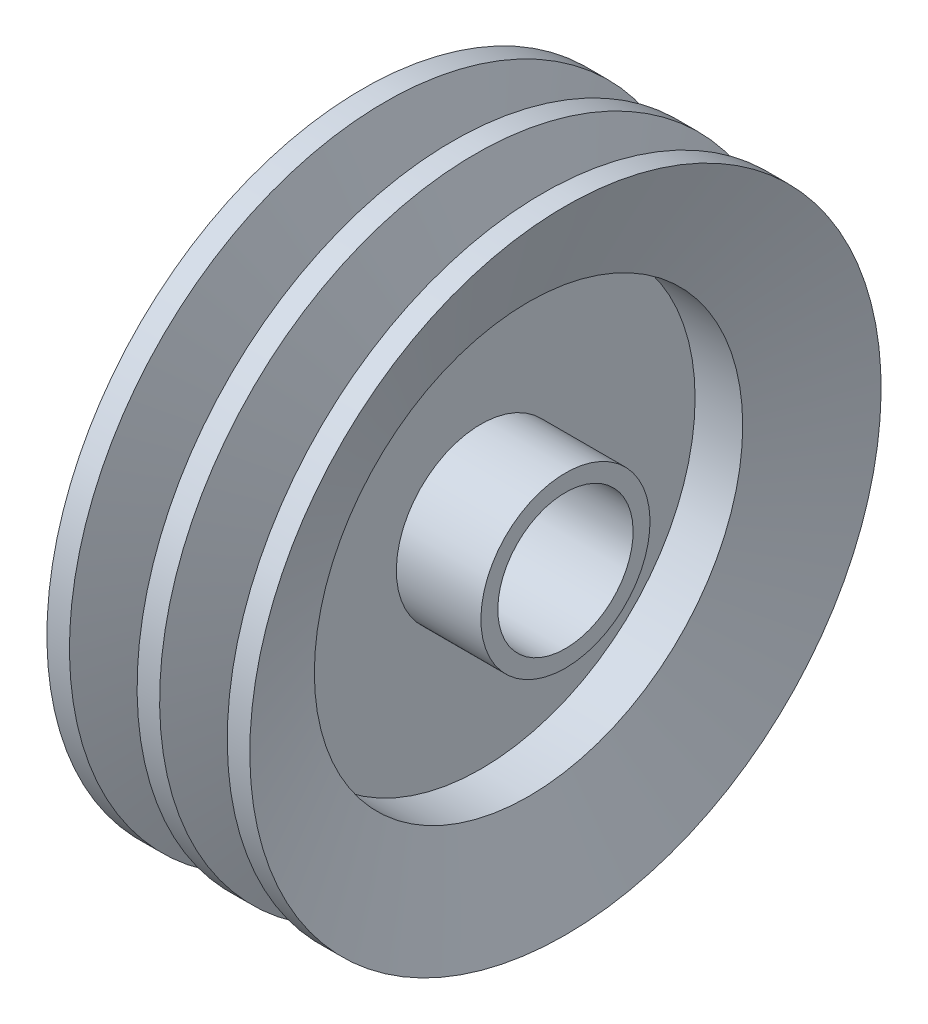
ISO-10303-21;
HEADER;
FILE_DESCRIPTION(('STEP AP214'),'2;1');
FILE_NAME('part.step','',(''),(''),'','','');
FILE_SCHEMA(('AUTOMOTIVE_DESIGN { 1 0 10303 214 1 1 1 1 }'));
ENDSEC;
DATA;
#1=APPLICATION_CONTEXT('core data for automotive mechanical design processes');
#2=APPLICATION_PROTOCOL_DEFINITION('international standard','automotive_design',2000,#1);
#3=PRODUCT_CONTEXT('',#1,'mechanical');
#4=PRODUCT('Part','Part','',(#3));
#5=PRODUCT_RELATED_PRODUCT_CATEGORY('part','',(#4));
#6=PRODUCT_DEFINITION_FORMATION('','',#4);
#7=PRODUCT_DEFINITION_CONTEXT('part definition',#1,'design');
#8=PRODUCT_DEFINITION('design','',#6,#7);
#9=PRODUCT_DEFINITION_SHAPE('','',#8);
#10=(LENGTH_UNIT() NAMED_UNIT(*) SI_UNIT(.MILLI.,.METRE.));
#11=(NAMED_UNIT(*) PLANE_ANGLE_UNIT() SI_UNIT($,.RADIAN.));
#12=(NAMED_UNIT(*) SI_UNIT($,.STERADIAN.) SOLID_ANGLE_UNIT());
#13=UNCERTAINTY_MEASURE_WITH_UNIT(LENGTH_MEASURE(1.E-05),#10,'distance_accuracy_value','');
#14=(GEOMETRIC_REPRESENTATION_CONTEXT(3) GLOBAL_UNCERTAINTY_ASSIGNED_CONTEXT((#13)) GLOBAL_UNIT_ASSIGNED_CONTEXT((#10,
#11,#12)) REPRESENTATION_CONTEXT('',''));
#15=CARTESIAN_POINT('',(0.,0.,0.));
#16=DIRECTION('',(0.,0.,1.));
#17=DIRECTION('',(1.,0.,0.));
#18=AXIS2_PLACEMENT_3D('',#15,#16,#17);
#19=CARTESIAN_POINT('',(45.,37.5,0.));
#20=DIRECTION('',(-1.,0.,0.));
#21=DIRECTION('',(0.,-1.,0.));
#22=AXIS2_PLACEMENT_3D('',#19,#20,#21);
#23=PLANE('',#22);
#24=CARTESIAN_POINT('',(45.,0.,0.));
#25=DIRECTION('',(-1.,0.,0.));
#26=DIRECTION('',(0.,-1.,0.));
#27=AXIS2_PLACEMENT_3D('',#24,#25,#26);
#28=CIRCLE('',#27,37.5);
#29=CARTESIAN_POINT('',(45.,-37.5,0.));
#30=VERTEX_POINT('',#29);
#31=EDGE_CURVE('E10',#30,#30,#28,.T.);
#32=ORIENTED_EDGE('',*,*,#31,.F.);
#33=EDGE_LOOP('',(#32));
#34=FACE_BOUND('',#33,.T.);
#35=CARTESIAN_POINT('',(45.,0.,0.));
#36=DIRECTION('',(-1.,0.,0.));
#37=DIRECTION('',(0.,-1.,0.));
#38=AXIS2_PLACEMENT_3D('',#35,#36,#37);
#39=CIRCLE('',#38,30.);
#40=CARTESIAN_POINT('',(45.,-30.,0.));
#41=VERTEX_POINT('',#40);
#42=EDGE_CURVE('E99',#41,#41,#39,.T.);
#43=ORIENTED_EDGE('',*,*,#42,.T.);
#44=EDGE_LOOP('',(#43));
#45=FACE_BOUND('',#44,.T.);
#46=ADVANCED_FACE('F35',(#34,#45),#23,.F.);
#47=CARTESIAN_POINT('',(-45.,0.,0.));
#48=DIRECTION('',(-1.,0.,0.));
#49=DIRECTION('',(0.,-1.,0.));
#50=AXIS2_PLACEMENT_3D('',#47,#48,#49);
#51=CYLINDRICAL_SURFACE('',#50,37.5);
#52=CARTESIAN_POINT('',(7.50000000000001,0.,0.));
#53=DIRECTION('',(-1.,0.,0.));
#54=DIRECTION('',(0.,-1.,0.));
#55=AXIS2_PLACEMENT_3D('',#52,#53,#54);
#56=CIRCLE('',#55,37.5);
#57=CARTESIAN_POINT('',(7.50000000000001,-37.5,0.));
#58=VERTEX_POINT('',#57);
#59=EDGE_CURVE('E41',#58,#58,#56,.T.);
#60=ORIENTED_EDGE('',*,*,#59,.F.);
#61=EDGE_LOOP('',(#60));
#62=FACE_BOUND('',#61,.T.);
#63=ORIENTED_EDGE('',*,*,#31,.T.);
#64=EDGE_LOOP('',(#63));
#65=FACE_BOUND('',#64,.T.);
#66=ADVANCED_FACE('F208',(#62,#65),#51,.T.);
#67=CARTESIAN_POINT('',(7.49999999999999,95.,0.));
#68=DIRECTION('',(-1.,0.,0.));
#69=DIRECTION('',(0.,-1.,0.));
#70=AXIS2_PLACEMENT_3D('',#67,#68,#69);
#71=PLANE('',#70);
#72=CARTESIAN_POINT('',(7.50000000000001,0.,0.));
#73=DIRECTION('',(-1.,0.,0.));
#74=DIRECTION('',(0.,-1.,0.));
#75=AXIS2_PLACEMENT_3D('',#72,#73,#74);
#76=CIRCLE('',#75,95.);
#77=CARTESIAN_POINT('',(7.50000000000003,-95.,0.));
#78=VERTEX_POINT('',#77);
#79=EDGE_CURVE('E45',#78,#78,#76,.T.);
#80=ORIENTED_EDGE('',*,*,#79,.F.);
#81=EDGE_LOOP('',(#80));
#82=FACE_BOUND('',#81,.T.);
#83=ORIENTED_EDGE('',*,*,#59,.T.);
#84=EDGE_LOOP('',(#83));
#85=FACE_BOUND('',#84,.T.);
#86=ADVANCED_FACE('F203',(#82,#85),#71,.F.);
#87=CARTESIAN_POINT('',(-45.,0.,0.));
#88=DIRECTION('',(-1.,0.,0.));
#89=DIRECTION('',(0.,-1.,0.));
#90=AXIS2_PLACEMENT_3D('',#87,#88,#89);
#91=CYLINDRICAL_SURFACE('',#90,95.);
#92=CARTESIAN_POINT('',(28.6213394580211,0.,0.));
#93=DIRECTION('',(-1.,0.,0.));
#94=DIRECTION('',(0.,-1.,0.));
#95=AXIS2_PLACEMENT_3D('',#92,#93,#94);
#96=CIRCLE('',#95,95.);
#97=CARTESIAN_POINT('',(28.6213394580211,-95.,0.));
#98=VERTEX_POINT('',#97);
#99=EDGE_CURVE('E49',#98,#98,#96,.T.);
#100=ORIENTED_EDGE('',*,*,#99,.F.);
#101=EDGE_LOOP('',(#100));
#102=FACE_BOUND('',#101,.T.);
#103=ORIENTED_EDGE('',*,*,#79,.T.);
#104=EDGE_LOOP('',(#103));
#105=FACE_BOUND('',#104,.T.);
#106=ADVANCED_FACE('F197',(#102,#105),#91,.F.);
#107=CARTESIAN_POINT('',(28.6213394580211,0.,0.));
#108=DIRECTION('',(1.,0.,0.));
#109=DIRECTION('',(0.,1.,0.));
#110=AXIS2_PLACEMENT_3D('',#107,#108,#109);
#111=CONICAL_SURFACE('',#110,95.,1.22173047639603);
#112=CARTESIAN_POINT('',(45.,0.,0.));
#113=DIRECTION('',(-1.,0.,0.));
#114=DIRECTION('',(0.,-1.,0.));
#115=AXIS2_PLACEMENT_3D('',#112,#113,#114);
#116=CIRCLE('',#115,140.);
#117=CARTESIAN_POINT('',(45.0000000000001,-140.,0.));
#118=VERTEX_POINT('',#117);
#119=EDGE_CURVE('E54',#118,#118,#116,.T.);
#120=ORIENTED_EDGE('',*,*,#119,.F.);
#121=EDGE_LOOP('',(#120));
#122=FACE_BOUND('',#121,.T.);
#123=ORIENTED_EDGE('',*,*,#99,.T.);
#124=EDGE_LOOP('',(#123));
#125=FACE_BOUND('',#124,.T.);
#126=ADVANCED_FACE('F191',(#122,#125),#111,.F.);
#127=CARTESIAN_POINT('',(-45.,0.,0.));
#128=DIRECTION('',(-1.,0.,0.));
#129=DIRECTION('',(0.,-1.,0.));
#130=AXIS2_PLACEMENT_3D('',#127,#128,#129);
#131=CYLINDRICAL_SURFACE('',#130,140.);
#132=CARTESIAN_POINT('',(35.,0.,0.));
#133=DIRECTION('',(-1.,0.,0.));
#134=DIRECTION('',(0.,-1.,0.));
#135=AXIS2_PLACEMENT_3D('',#132,#133,#134);
#136=CIRCLE('',#135,140.);
#137=CARTESIAN_POINT('',(35.,-140.,0.));
#138=VERTEX_POINT('',#137);
#139=EDGE_CURVE('E57',#138,#138,#136,.T.);
#140=ORIENTED_EDGE('',*,*,#139,.F.);
#141=EDGE_LOOP('',(#140));
#142=FACE_BOUND('',#141,.T.);
#143=ORIENTED_EDGE('',*,*,#119,.T.);
#144=EDGE_LOOP('',(#143));
#145=FACE_BOUND('',#144,.T.);
#146=ADVANCED_FACE('F185',(#142,#145),#131,.T.);
#147=CARTESIAN_POINT('',(35.,0.,0.));
#148=DIRECTION('',(1.,0.,0.));
#149=DIRECTION('',(0.,1.,0.));
#150=AXIS2_PLACEMENT_3D('',#147,#148,#149);
#151=CONICAL_SURFACE('',#150,140.,1.22173047639603);
#152=CARTESIAN_POINT('',(24.080892972014,0.,0.));
#153=DIRECTION('',(-1.,0.,0.));
#154=DIRECTION('',(0.,-1.,0.));
#155=AXIS2_PLACEMENT_3D('',#152,#153,#154);
#156=CIRCLE('',#155,110.);
#157=CARTESIAN_POINT('',(24.0808929720141,-110.,0.));
#158=VERTEX_POINT('',#157);
#159=EDGE_CURVE('E60',#158,#158,#156,.T.);
#160=ORIENTED_EDGE('',*,*,#159,.F.);
#161=EDGE_LOOP('',(#160));
#162=FACE_BOUND('',#161,.T.);
#163=ORIENTED_EDGE('',*,*,#139,.T.);
#164=EDGE_LOOP('',(#163));
#165=FACE_BOUND('',#164,.T.);
#166=ADVANCED_FACE('F179',(#162,#165),#151,.T.);
#167=CARTESIAN_POINT('',(-45.,0.,0.));
#168=DIRECTION('',(-1.,0.,0.));
#169=DIRECTION('',(0.,-1.,0.));
#170=AXIS2_PLACEMENT_3D('',#167,#168,#169);
#171=CYLINDRICAL_SURFACE('',#170,110.);
#172=CARTESIAN_POINT('',(15.919107027986,0.,0.));
#173=DIRECTION('',(-1.,0.,0.));
#174=DIRECTION('',(0.,-1.,0.));
#175=AXIS2_PLACEMENT_3D('',#172,#173,#174);
#176=CIRCLE('',#175,110.);
#177=CARTESIAN_POINT('',(15.919107027986,-110.,0.));
#178=VERTEX_POINT('',#177);
#179=EDGE_CURVE('E63',#178,#178,#176,.T.);
#180=ORIENTED_EDGE('',*,*,#179,.F.);
#181=EDGE_LOOP('',(#180));
#182=FACE_BOUND('',#181,.T.);
#183=ORIENTED_EDGE('',*,*,#159,.T.);
#184=EDGE_LOOP('',(#183));
#185=FACE_BOUND('',#184,.T.);
#186=ADVANCED_FACE('F173',(#182,#185),#171,.T.);
#187=CARTESIAN_POINT('',(15.919107027986,0.,0.));
#188=DIRECTION('',(-1.,0.,0.));
#189=DIRECTION('',(0.,-1.,0.));
#190=AXIS2_PLACEMENT_3D('',#187,#188,#189);
#191=CONICAL_SURFACE('',#190,110.,1.22173047639603);
#192=CARTESIAN_POINT('',(5.00000000000002,0.,0.));
#193=DIRECTION('',(-1.,0.,0.));
#194=DIRECTION('',(0.,-1.,0.));
#195=AXIS2_PLACEMENT_3D('',#192,#193,#194);
#196=CIRCLE('',#195,140.);
#197=CARTESIAN_POINT('',(5.00000000000005,-140.,0.));
#198=VERTEX_POINT('',#197);
#199=EDGE_CURVE('E66',#198,#198,#196,.T.);
#200=ORIENTED_EDGE('',*,*,#199,.F.);
#201=EDGE_LOOP('',(#200));
#202=FACE_BOUND('',#201,.T.);
#203=ORIENTED_EDGE('',*,*,#179,.T.);
#204=EDGE_LOOP('',(#203));
#205=FACE_BOUND('',#204,.T.);
#206=ADVANCED_FACE('F167',(#202,#205),#191,.T.);
#207=CARTESIAN_POINT('',(-45.,0.,0.));
#208=DIRECTION('',(-1.,0.,0.));
#209=DIRECTION('',(0.,-1.,0.));
#210=AXIS2_PLACEMENT_3D('',#207,#208,#209);
#211=CYLINDRICAL_SURFACE('',#210,140.);
#212=CARTESIAN_POINT('',(-4.99999999999997,0.,0.));
#213=DIRECTION('',(-1.,0.,0.));
#214=DIRECTION('',(0.,-1.,0.));
#215=AXIS2_PLACEMENT_3D('',#212,#213,#214);
#216=CIRCLE('',#215,140.);
#217=CARTESIAN_POINT('',(-4.99999999999994,-140.,0.));
#218=VERTEX_POINT('',#217);
#219=EDGE_CURVE('E69',#218,#218,#216,.T.);
#220=ORIENTED_EDGE('',*,*,#219,.F.);
#221=EDGE_LOOP('',(#220));
#222=FACE_BOUND('',#221,.T.);
#223=ORIENTED_EDGE('',*,*,#199,.T.);
#224=EDGE_LOOP('',(#223));
#225=FACE_BOUND('',#224,.T.);
#226=ADVANCED_FACE('F161',(#222,#225),#211,.T.);
#227=CARTESIAN_POINT('',(-4.99999999999997,0.,0.));
#228=DIRECTION('',(1.,0.,0.));
#229=DIRECTION('',(0.,1.,0.));
#230=AXIS2_PLACEMENT_3D('',#227,#228,#229);
#231=CONICAL_SURFACE('',#230,140.,1.22173047639603);
#232=CARTESIAN_POINT('',(-15.919107027986,0.,0.));
#233=DIRECTION('',(-1.,0.,0.));
#234=DIRECTION('',(0.,-1.,0.));
#235=AXIS2_PLACEMENT_3D('',#232,#233,#234);
#236=CIRCLE('',#235,110.);
#237=CARTESIAN_POINT('',(-15.9191070279859,-110.,0.));
#238=VERTEX_POINT('',#237);
#239=EDGE_CURVE('E72',#238,#238,#236,.T.);
#240=ORIENTED_EDGE('',*,*,#239,.F.);
#241=EDGE_LOOP('',(#240));
#242=FACE_BOUND('',#241,.T.);
#243=ORIENTED_EDGE('',*,*,#219,.T.);
#244=EDGE_LOOP('',(#243));
#245=FACE_BOUND('',#244,.T.);
#246=ADVANCED_FACE('F155',(#242,#245),#231,.T.);
#247=CARTESIAN_POINT('',(-45.,0.,0.));
#248=DIRECTION('',(-1.,0.,0.));
#249=DIRECTION('',(0.,-1.,0.));
#250=AXIS2_PLACEMENT_3D('',#247,#248,#249);
#251=CYLINDRICAL_SURFACE('',#250,110.);
#252=CARTESIAN_POINT('',(-24.080892972014,0.,0.));
#253=DIRECTION('',(-1.,0.,0.));
#254=DIRECTION('',(0.,-1.,0.));
#255=AXIS2_PLACEMENT_3D('',#252,#253,#254);
#256=CIRCLE('',#255,110.);
#257=CARTESIAN_POINT('',(-24.080892972014,-110.,0.));
#258=VERTEX_POINT('',#257);
#259=EDGE_CURVE('E75',#258,#258,#256,.T.);
#260=ORIENTED_EDGE('',*,*,#259,.F.);
#261=EDGE_LOOP('',(#260));
#262=FACE_BOUND('',#261,.T.);
#263=ORIENTED_EDGE('',*,*,#239,.T.);
#264=EDGE_LOOP('',(#263));
#265=FACE_BOUND('',#264,.T.);
#266=ADVANCED_FACE('F149',(#262,#265),#251,.T.);
#267=CARTESIAN_POINT('',(-24.080892972014,0.,0.));
#268=DIRECTION('',(-1.,0.,0.));
#269=DIRECTION('',(0.,-1.,0.));
#270=AXIS2_PLACEMENT_3D('',#267,#268,#269);
#271=CONICAL_SURFACE('',#270,110.,1.22173047639603);
#272=CARTESIAN_POINT('',(-35.,0.,0.));
#273=DIRECTION('',(-1.,0.,0.));
#274=DIRECTION('',(0.,-1.,0.));
#275=AXIS2_PLACEMENT_3D('',#272,#273,#274);
#276=CIRCLE('',#275,140.);
#277=CARTESIAN_POINT('',(-34.9999999999999,-140.,0.));
#278=VERTEX_POINT('',#277);
#279=EDGE_CURVE('E78',#278,#278,#276,.T.);
#280=ORIENTED_EDGE('',*,*,#279,.F.);
#281=EDGE_LOOP('',(#280));
#282=FACE_BOUND('',#281,.T.);
#283=ORIENTED_EDGE('',*,*,#259,.T.);
#284=EDGE_LOOP('',(#283));
#285=FACE_BOUND('',#284,.T.);
#286=ADVANCED_FACE('F143',(#282,#285),#271,.T.);
#287=CARTESIAN_POINT('',(-45.,0.,0.));
#288=DIRECTION('',(-1.,0.,0.));
#289=DIRECTION('',(0.,-1.,0.));
#290=AXIS2_PLACEMENT_3D('',#287,#288,#289);
#291=CYLINDRICAL_SURFACE('',#290,140.);
#292=CARTESIAN_POINT('',(-45.,0.,0.));
#293=DIRECTION('',(-1.,0.,0.));
#294=DIRECTION('',(0.,-1.,0.));
#295=AXIS2_PLACEMENT_3D('',#292,#293,#294);
#296=CIRCLE('',#295,140.);
#297=CARTESIAN_POINT('',(-44.9999999999999,-140.,0.));
#298=VERTEX_POINT('',#297);
#299=EDGE_CURVE('E81',#298,#298,#296,.T.);
#300=ORIENTED_EDGE('',*,*,#299,.F.);
#301=EDGE_LOOP('',(#300));
#302=FACE_BOUND('',#301,.T.);
#303=ORIENTED_EDGE('',*,*,#279,.T.);
#304=EDGE_LOOP('',(#303));
#305=FACE_BOUND('',#304,.T.);
#306=ADVANCED_FACE('F137',(#302,#305),#291,.T.);
#307=CARTESIAN_POINT('',(-45.,0.,0.));
#308=DIRECTION('',(-1.,0.,0.));
#309=DIRECTION('',(0.,-1.,0.));
#310=AXIS2_PLACEMENT_3D('',#307,#308,#309);
#311=CONICAL_SURFACE('',#310,140.,1.22173047639603);
#312=CARTESIAN_POINT('',(-28.6213394580211,0.,0.));
#313=DIRECTION('',(-1.,0.,0.));
#314=DIRECTION('',(0.,-1.,0.));
#315=AXIS2_PLACEMENT_3D('',#312,#313,#314);
#316=CIRCLE('',#315,95.);
#317=CARTESIAN_POINT('',(-28.621339458021,-95.,0.));
#318=VERTEX_POINT('',#317);
#319=EDGE_CURVE('E84',#318,#318,#316,.T.);
#320=ORIENTED_EDGE('',*,*,#319,.F.);
#321=EDGE_LOOP('',(#320));
#322=FACE_BOUND('',#321,.T.);
#323=ORIENTED_EDGE('',*,*,#299,.T.);
#324=EDGE_LOOP('',(#323));
#325=FACE_BOUND('',#324,.T.);
#326=ADVANCED_FACE('F131',(#322,#325),#311,.F.);
#327=CARTESIAN_POINT('',(-45.,0.,0.));
#328=DIRECTION('',(-1.,0.,0.));
#329=DIRECTION('',(0.,-1.,0.));
#330=AXIS2_PLACEMENT_3D('',#327,#328,#329);
#331=CYLINDRICAL_SURFACE('',#330,95.);
#332=CARTESIAN_POINT('',(-7.49999999999997,0.,0.));
#333=DIRECTION('',(-1.,0.,0.));
#334=DIRECTION('',(0.,-1.,0.));
#335=AXIS2_PLACEMENT_3D('',#332,#333,#334);
#336=CIRCLE('',#335,95.);
#337=CARTESIAN_POINT('',(-7.49999999999995,-95.,0.));
#338=VERTEX_POINT('',#337);
#339=EDGE_CURVE('E87',#338,#338,#336,.T.);
#340=ORIENTED_EDGE('',*,*,#339,.F.);
#341=EDGE_LOOP('',(#340));
#342=FACE_BOUND('',#341,.T.);
#343=ORIENTED_EDGE('',*,*,#319,.T.);
#344=EDGE_LOOP('',(#343));
#345=FACE_BOUND('',#344,.T.);
#346=ADVANCED_FACE('F125',(#342,#345),#331,.F.);
#347=CARTESIAN_POINT('',(-7.50000000000001,95.,0.));
#348=DIRECTION('',(1.,0.,0.));
#349=DIRECTION('',(0.,1.,0.));
#350=AXIS2_PLACEMENT_3D('',#347,#348,#349);
#351=PLANE('',#350);
#352=CARTESIAN_POINT('',(-7.49999999999999,0.,0.));
#353=DIRECTION('',(-1.,0.,0.));
#354=DIRECTION('',(0.,-1.,0.));
#355=AXIS2_PLACEMENT_3D('',#352,#353,#354);
#356=CIRCLE('',#355,37.5);
#357=CARTESIAN_POINT('',(-7.49999999999999,-37.5,0.));
#358=VERTEX_POINT('',#357);
#359=EDGE_CURVE('E90',#358,#358,#356,.T.);
#360=ORIENTED_EDGE('',*,*,#359,.F.);
#361=EDGE_LOOP('',(#360));
#362=FACE_BOUND('',#361,.T.);
#363=ORIENTED_EDGE('',*,*,#339,.T.);
#364=EDGE_LOOP('',(#363));
#365=FACE_BOUND('',#364,.T.);
#366=ADVANCED_FACE('F119',(#362,#365),#351,.F.);
#367=CARTESIAN_POINT('',(-45.,0.,0.));
#368=DIRECTION('',(-1.,0.,0.));
#369=DIRECTION('',(0.,-1.,0.));
#370=AXIS2_PLACEMENT_3D('',#367,#368,#369);
#371=CYLINDRICAL_SURFACE('',#370,37.5);
#372=CARTESIAN_POINT('',(-45.,0.,0.));
#373=DIRECTION('',(-1.,0.,0.));
#374=DIRECTION('',(0.,-1.,0.));
#375=AXIS2_PLACEMENT_3D('',#372,#373,#374);
#376=CIRCLE('',#375,37.5);
#377=CARTESIAN_POINT('',(-45.,-37.5,0.));
#378=VERTEX_POINT('',#377);
#379=EDGE_CURVE('E93',#378,#378,#376,.T.);
#380=ORIENTED_EDGE('',*,*,#379,.F.);
#381=EDGE_LOOP('',(#380));
#382=FACE_BOUND('',#381,.T.);
#383=ORIENTED_EDGE('',*,*,#359,.T.);
#384=EDGE_LOOP('',(#383));
#385=FACE_BOUND('',#384,.T.);
#386=ADVANCED_FACE('F113',(#382,#385),#371,.T.);
#387=CARTESIAN_POINT('',(-45.,37.5,0.));
#388=DIRECTION('',(1.,0.,0.));
#389=DIRECTION('',(0.,1.,0.));
#390=AXIS2_PLACEMENT_3D('',#387,#388,#389);
#391=PLANE('',#390);
#392=CARTESIAN_POINT('',(-45.,0.,0.));
#393=DIRECTION('',(-1.,0.,0.));
#394=DIRECTION('',(0.,-1.,0.));
#395=AXIS2_PLACEMENT_3D('',#392,#393,#394);
#396=CIRCLE('',#395,30.);
#397=CARTESIAN_POINT('',(-45.,-30.,0.));
#398=VERTEX_POINT('',#397);
#399=EDGE_CURVE('E96',#398,#398,#396,.T.);
#400=ORIENTED_EDGE('',*,*,#399,.F.);
#401=EDGE_LOOP('',(#400));
#402=FACE_BOUND('',#401,.T.);
#403=ORIENTED_EDGE('',*,*,#379,.T.);
#404=EDGE_LOOP('',(#403));
#405=FACE_BOUND('',#404,.T.);
#406=ADVANCED_FACE('F107',(#402,#405),#391,.F.);
#407=CARTESIAN_POINT('',(-45.,0.,0.));
#408=DIRECTION('',(-1.,0.,0.));
#409=DIRECTION('',(0.,-1.,0.));
#410=AXIS2_PLACEMENT_3D('',#407,#408,#409);
#411=CYLINDRICAL_SURFACE('',#410,30.);
#412=ORIENTED_EDGE('',*,*,#42,.F.);
#413=EDGE_LOOP('',(#412));
#414=FACE_BOUND('',#413,.T.);
#415=ORIENTED_EDGE('',*,*,#399,.T.);
#416=EDGE_LOOP('',(#415));
#417=FACE_BOUND('',#416,.T.);
#418=ADVANCED_FACE('F104',(#414,#417),#411,.F.);
#419=CLOSED_SHELL('',(#46,#66,#86,#106,#126,#146,#166,#186,#206,#226,#246,#266,#286,#306,#326,
#346,#366,#386,#406,#418));
#420=MANIFOLD_SOLID_BREP('B2',#419);
#421=ADVANCED_BREP_SHAPE_REPRESENTATION('',(#18,#420),#14);
#422=SHAPE_DEFINITION_REPRESENTATION(#9,#421);
ENDSEC;
END-ISO-10303-21;
